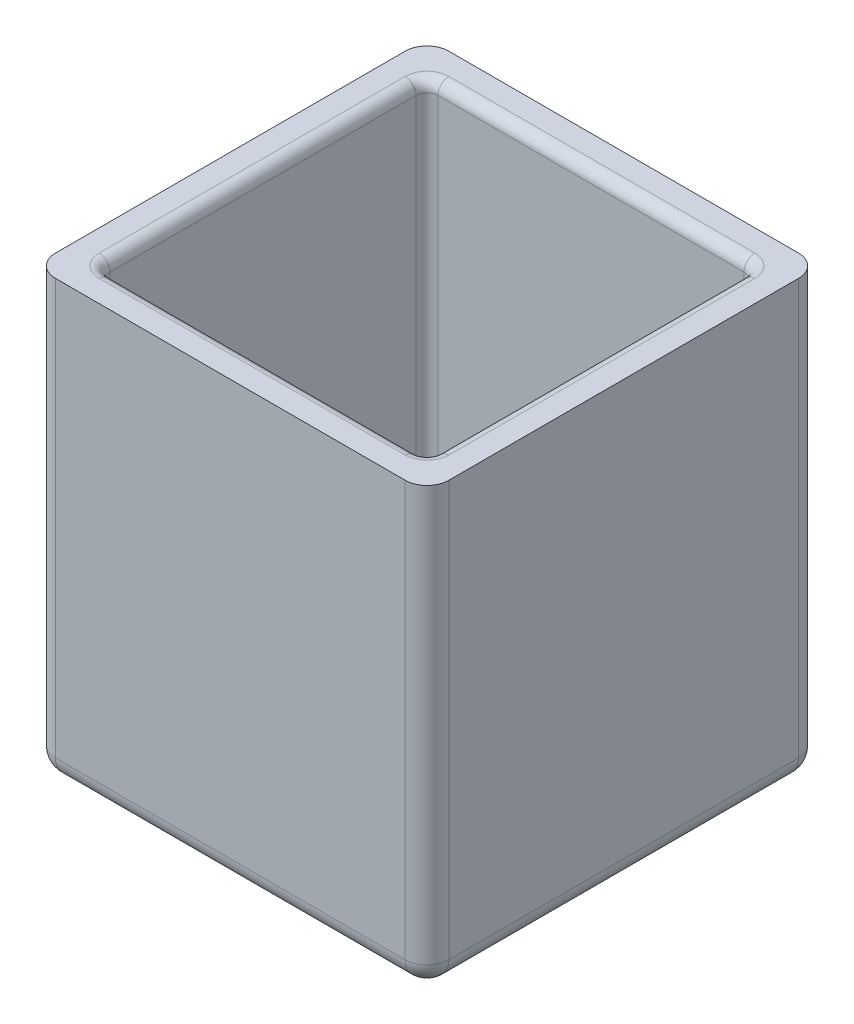
ISO-10303-21;
HEADER;
FILE_DESCRIPTION(('STEP AP214'),'2;1');
FILE_NAME('part.step','',(''),(''),'','','');
FILE_SCHEMA(('AUTOMOTIVE_DESIGN { 1 0 10303 214 1 1 1 1 }'));
ENDSEC;
DATA;
#1=APPLICATION_CONTEXT('core data for automotive mechanical design processes');
#2=APPLICATION_PROTOCOL_DEFINITION('international standard','automotive_design',2000,#1);
#3=PRODUCT_CONTEXT('',#1,'mechanical');
#4=PRODUCT('Part','Part','',(#3));
#5=PRODUCT_RELATED_PRODUCT_CATEGORY('part','',(#4));
#6=PRODUCT_DEFINITION_FORMATION('','',#4);
#7=PRODUCT_DEFINITION_CONTEXT('part definition',#1,'design');
#8=PRODUCT_DEFINITION('design','',#6,#7);
#9=PRODUCT_DEFINITION_SHAPE('','',#8);
#10=(LENGTH_UNIT() NAMED_UNIT(*) SI_UNIT(.MILLI.,.METRE.));
#11=(NAMED_UNIT(*) PLANE_ANGLE_UNIT() SI_UNIT($,.RADIAN.));
#12=(NAMED_UNIT(*) SI_UNIT($,.STERADIAN.) SOLID_ANGLE_UNIT());
#13=UNCERTAINTY_MEASURE_WITH_UNIT(LENGTH_MEASURE(1.E-05),#10,'distance_accuracy_value','');
#14=(GEOMETRIC_REPRESENTATION_CONTEXT(3) GLOBAL_UNCERTAINTY_ASSIGNED_CONTEXT((#13)) GLOBAL_UNIT_ASSIGNED_CONTEXT((#10,
#11,#12)) REPRESENTATION_CONTEXT('',''));
#15=CARTESIAN_POINT('',(0.,0.,0.));
#16=DIRECTION('',(0.,0.,1.));
#17=DIRECTION('',(1.,0.,0.));
#18=AXIS2_PLACEMENT_3D('',#15,#16,#17);
#19=CARTESIAN_POINT('',(0.,40.,0.));
#20=DIRECTION('',(0.,-1.,0.));
#21=DIRECTION('',(0.,0.,-1.));
#22=AXIS2_PLACEMENT_3D('',#19,#20,#21);
#23=PLANE('',#22);
#24=DIRECTION('',(-1.,0.,0.));
#25=VECTOR('',#24,1.);
#26=CARTESIAN_POINT('',(0.,40.,-36.));
#27=LINE('',#26,#25);
#28=CARTESIAN_POINT('',(34.,40.,-36.));
#29=VERTEX_POINT('',#28);
#30=CARTESIAN_POINT('',(2.,40.,-36.));
#31=VERTEX_POINT('',#30);
#32=EDGE_CURVE('E206',#29,#31,#27,.T.);
#33=ORIENTED_EDGE('',*,*,#32,.T.);
#34=CARTESIAN_POINT('',(2.,40.,-34.));
#35=DIRECTION('',(0.,-1.,0.));
#36=DIRECTION('',(0.,0.,-1.));
#37=AXIS2_PLACEMENT_3D('',#34,#35,#36);
#38=CIRCLE('',#37,2.);
#39=CARTESIAN_POINT('',(0.,40.,-34.));
#40=VERTEX_POINT('',#39);
#41=EDGE_CURVE('E200',#31,#40,#38,.F.);
#42=ORIENTED_EDGE('',*,*,#41,.T.);
#43=DIRECTION('',(0.,0.,1.));
#44=VECTOR('',#43,1.);
#45=CARTESIAN_POINT('',(0.,40.,0.));
#46=LINE('',#45,#44);
#47=CARTESIAN_POINT('',(0.,40.,-2.));
#48=VERTEX_POINT('',#47);
#49=EDGE_CURVE('E203',#40,#48,#46,.T.);
#50=ORIENTED_EDGE('',*,*,#49,.T.);
#51=CARTESIAN_POINT('',(2.,40.,-2.));
#52=DIRECTION('',(0.,-1.,0.));
#53=DIRECTION('',(0.,0.,-1.));
#54=AXIS2_PLACEMENT_3D('',#51,#52,#53);
#55=CIRCLE('',#54,2.);
#56=CARTESIAN_POINT('',(2.,40.,0.));
#57=VERTEX_POINT('',#56);
#58=EDGE_CURVE('E211',#48,#57,#55,.F.);
#59=ORIENTED_EDGE('',*,*,#58,.T.);
#60=DIRECTION('',(1.,0.,0.));
#61=VECTOR('',#60,1.);
#62=CARTESIAN_POINT('',(0.,40.,0.));
#63=LINE('',#62,#61);
#64=CARTESIAN_POINT('',(34.,40.,0.));
#65=VERTEX_POINT('',#64);
#66=EDGE_CURVE('E220',#57,#65,#63,.T.);
#67=ORIENTED_EDGE('',*,*,#66,.T.);
#68=CARTESIAN_POINT('',(34.,40.,-2.));
#69=DIRECTION('',(0.,-1.,0.));
#70=DIRECTION('',(0.,0.,-1.));
#71=AXIS2_PLACEMENT_3D('',#68,#69,#70);
#72=CIRCLE('',#71,2.);
#73=CARTESIAN_POINT('',(36.,40.,-2.));
#74=VERTEX_POINT('',#73);
#75=EDGE_CURVE('E235',#65,#74,#72,.F.);
#76=ORIENTED_EDGE('',*,*,#75,.T.);
#77=DIRECTION('',(0.,0.,-1.));
#78=VECTOR('',#77,1.);
#79=CARTESIAN_POINT('',(36.,40.,0.));
#80=LINE('',#79,#78);
#81=CARTESIAN_POINT('',(36.,40.,-34.));
#82=VERTEX_POINT('',#81);
#83=EDGE_CURVE('E911',#74,#82,#80,.T.);
#84=ORIENTED_EDGE('',*,*,#83,.T.);
#85=CARTESIAN_POINT('',(34.,40.,-34.));
#86=DIRECTION('',(0.,-1.,0.));
#87=DIRECTION('',(0.,0.,-1.));
#88=AXIS2_PLACEMENT_3D('',#85,#86,#87);
#89=CIRCLE('',#88,2.);
#90=EDGE_CURVE('E237',#82,#29,#89,.F.);
#91=ORIENTED_EDGE('',*,*,#90,.T.);
#92=EDGE_LOOP('',(#33,#42,#50,#59,#67,#76,#84,#91));
#93=FACE_BOUND('',#92,.T.);
#94=CARTESIAN_POINT('',(32.,40.,-4.));
#95=DIRECTION('',(0.,-1.,0.));
#96=DIRECTION('',(0.,0.,-1.));
#97=AXIS2_PLACEMENT_3D('',#94,#95,#96);
#98=CIRCLE('',#97,2.);
#99=CARTESIAN_POINT('',(32.,40.,-2.));
#100=VERTEX_POINT('',#99);
#101=CARTESIAN_POINT('',(34.,40.,-4.));
#102=VERTEX_POINT('',#101);
#103=EDGE_CURVE('E322',#100,#102,#98,.F.);
#104=ORIENTED_EDGE('',*,*,#103,.F.);
#105=DIRECTION('',(1.,0.,0.));
#106=VECTOR('',#105,1.);
#107=CARTESIAN_POINT('',(3.,40.,-2.));
#108=LINE('',#107,#106);
#109=CARTESIAN_POINT('',(4.,40.,-2.));
#110=VERTEX_POINT('',#109);
#111=EDGE_CURVE('E319',#100,#110,#108,.F.);
#112=ORIENTED_EDGE('',*,*,#111,.T.);
#113=CARTESIAN_POINT('',(4.,40.,-4.));
#114=DIRECTION('',(0.,-1.,0.));
#115=DIRECTION('',(0.,0.,-1.));
#116=AXIS2_PLACEMENT_3D('',#113,#114,#115);
#117=CIRCLE('',#116,2.);
#118=CARTESIAN_POINT('',(2.,40.,-4.));
#119=VERTEX_POINT('',#118);
#120=EDGE_CURVE('E316',#119,#110,#117,.F.);
#121=ORIENTED_EDGE('',*,*,#120,.F.);
#122=DIRECTION('',(0.,0.,1.));
#123=VECTOR('',#122,1.);
#124=CARTESIAN_POINT('',(2.,40.,-33.));
#125=LINE('',#124,#123);
#126=CARTESIAN_POINT('',(2.,40.,-32.));
#127=VERTEX_POINT('',#126);
#128=EDGE_CURVE('E312',#119,#127,#125,.F.);
#129=ORIENTED_EDGE('',*,*,#128,.T.);
#130=CARTESIAN_POINT('',(4.,40.,-32.));
#131=DIRECTION('',(0.,-1.,0.));
#132=DIRECTION('',(0.,0.,-1.));
#133=AXIS2_PLACEMENT_3D('',#130,#131,#132);
#134=CIRCLE('',#133,2.);
#135=CARTESIAN_POINT('',(4.,40.,-34.));
#136=VERTEX_POINT('',#135);
#137=EDGE_CURVE('E309',#136,#127,#134,.F.);
#138=ORIENTED_EDGE('',*,*,#137,.F.);
#139=DIRECTION('',(-1.,0.,0.));
#140=VECTOR('',#139,1.);
#141=CARTESIAN_POINT('',(33.,40.,-34.));
#142=LINE('',#141,#140);
#143=CARTESIAN_POINT('',(32.,40.,-34.));
#144=VERTEX_POINT('',#143);
#145=EDGE_CURVE('E307',#136,#144,#142,.F.);
#146=ORIENTED_EDGE('',*,*,#145,.T.);
#147=CARTESIAN_POINT('',(32.,40.,-32.));
#148=DIRECTION('',(0.,-1.,0.));
#149=DIRECTION('',(0.,0.,-1.));
#150=AXIS2_PLACEMENT_3D('',#147,#148,#149);
#151=CIRCLE('',#150,2.);
#152=CARTESIAN_POINT('',(34.,40.,-32.));
#153=VERTEX_POINT('',#152);
#154=EDGE_CURVE('E304',#153,#144,#151,.F.);
#155=ORIENTED_EDGE('',*,*,#154,.F.);
#156=DIRECTION('',(0.,0.,-1.));
#157=VECTOR('',#156,1.);
#158=CARTESIAN_POINT('',(34.,40.,-3.));
#159=LINE('',#158,#157);
#160=EDGE_CURVE('E314',#153,#102,#159,.F.);
#161=ORIENTED_EDGE('',*,*,#160,.T.);
#162=EDGE_LOOP('',(#104,#112,#121,#129,#138,#146,#155,#161));
#163=FACE_BOUND('',#162,.T.);
#164=ADVANCED_FACE('F38',(#93,#163),#23,.F.);
#165=CARTESIAN_POINT('',(3.,40.,-33.));
#166=DIRECTION('',(1.,0.,0.));
#167=DIRECTION('',(0.,0.,-1.));
#168=AXIS2_PLACEMENT_3D('',#165,#166,#167);
#169=PLANE('',#168);
#170=DIRECTION('',(0.,0.,-1.));
#171=VECTOR('',#170,1.);
#172=CARTESIAN_POINT('',(3.,4.,-33.));
#173=LINE('',#172,#171);
#174=CARTESIAN_POINT('',(3.,4.,-4.));
#175=VERTEX_POINT('',#174);
#176=CARTESIAN_POINT('',(3.,4.,-32.));
#177=VERTEX_POINT('',#176);
#178=EDGE_CURVE('E336',#175,#177,#173,.T.);
#179=ORIENTED_EDGE('',*,*,#178,.T.);
#180=DIRECTION('',(0.,-1.,0.));
#181=VECTOR('',#180,1.);
#182=CARTESIAN_POINT('',(3.,40.,-32.));
#183=LINE('',#182,#181);
#184=CARTESIAN_POINT('',(3.,39.,-32.));
#185=VERTEX_POINT('',#184);
#186=EDGE_CURVE('E341',#177,#185,#183,.F.);
#187=ORIENTED_EDGE('',*,*,#186,.T.);
#188=DIRECTION('',(0.,0.,1.));
#189=VECTOR('',#188,1.);
#190=CARTESIAN_POINT('',(3.,39.,-3.));
#191=LINE('',#190,#189);
#192=CARTESIAN_POINT('',(3.,39.,-4.));
#193=VERTEX_POINT('',#192);
#194=EDGE_CURVE('E338',#185,#193,#191,.T.);
#195=ORIENTED_EDGE('',*,*,#194,.T.);
#196=DIRECTION('',(0.,-1.,0.));
#197=VECTOR('',#196,1.);
#198=CARTESIAN_POINT('',(3.,3.,-4.));
#199=LINE('',#198,#197);
#200=EDGE_CURVE('E334',#193,#175,#199,.T.);
#201=ORIENTED_EDGE('',*,*,#200,.T.);
#202=EDGE_LOOP('',(#179,#187,#195,#201));
#203=FACE_BOUND('',#202,.T.);
#204=ADVANCED_FACE('F436',(#203),#169,.T.);
#205=CARTESIAN_POINT('',(3.,40.,-3.));
#206=DIRECTION('',(0.,0.,-1.));
#207=DIRECTION('',(-1.,0.,0.));
#208=AXIS2_PLACEMENT_3D('',#205,#206,#207);
#209=PLANE('',#208);
#210=DIRECTION('',(1.,0.,0.));
#211=VECTOR('',#210,1.);
#212=CARTESIAN_POINT('',(33.,39.,-3.));
#213=LINE('',#212,#211);
#214=CARTESIAN_POINT('',(4.,39.,-3.));
#215=VERTEX_POINT('',#214);
#216=CARTESIAN_POINT('',(32.,39.,-3.));
#217=VERTEX_POINT('',#216);
#218=EDGE_CURVE('E299',#215,#217,#213,.T.);
#219=ORIENTED_EDGE('',*,*,#218,.T.);
#220=DIRECTION('',(0.,-1.,0.));
#221=VECTOR('',#220,1.);
#222=CARTESIAN_POINT('',(32.,3.,-3.));
#223=LINE('',#222,#221);
#224=CARTESIAN_POINT('',(32.,4.,-3.));
#225=VERTEX_POINT('',#224);
#226=EDGE_CURVE('E302',#217,#225,#223,.T.);
#227=ORIENTED_EDGE('',*,*,#226,.T.);
#228=DIRECTION('',(-1.,0.,0.));
#229=VECTOR('',#228,1.);
#230=CARTESIAN_POINT('',(3.,4.,-3.));
#231=LINE('',#230,#229);
#232=CARTESIAN_POINT('',(4.,4.,-3.));
#233=VERTEX_POINT('',#232);
#234=EDGE_CURVE('E297',#225,#233,#231,.T.);
#235=ORIENTED_EDGE('',*,*,#234,.T.);
#236=DIRECTION('',(0.,-1.,0.));
#237=VECTOR('',#236,1.);
#238=CARTESIAN_POINT('',(4.,40.,-3.));
#239=LINE('',#238,#237);
#240=EDGE_CURVE('E274',#233,#215,#239,.F.);
#241=ORIENTED_EDGE('',*,*,#240,.T.);
#242=EDGE_LOOP('',(#219,#227,#235,#241));
#243=FACE_BOUND('',#242,.T.);
#244=ADVANCED_FACE('F491',(#243),#209,.T.);
#245=CARTESIAN_POINT('',(33.,40.,-33.));
#246=DIRECTION('',(-1.,0.,0.));
#247=DIRECTION('',(0.,0.,1.));
#248=AXIS2_PLACEMENT_3D('',#245,#246,#247);
#249=PLANE('',#248);
#250=DIRECTION('',(0.,0.,-1.));
#251=VECTOR('',#250,1.);
#252=CARTESIAN_POINT('',(33.,39.,-33.));
#253=LINE('',#252,#251);
#254=CARTESIAN_POINT('',(33.,39.,-4.));
#255=VERTEX_POINT('',#254);
#256=CARTESIAN_POINT('',(33.,39.,-32.));
#257=VERTEX_POINT('',#256);
#258=EDGE_CURVE('E329',#255,#257,#253,.T.);
#259=ORIENTED_EDGE('',*,*,#258,.T.);
#260=DIRECTION('',(0.,-1.,0.));
#261=VECTOR('',#260,1.);
#262=CARTESIAN_POINT('',(33.,3.,-32.));
#263=LINE('',#262,#261);
#264=CARTESIAN_POINT('',(33.,4.,-32.));
#265=VERTEX_POINT('',#264);
#266=EDGE_CURVE('E332',#257,#265,#263,.T.);
#267=ORIENTED_EDGE('',*,*,#266,.T.);
#268=DIRECTION('',(0.,0.,1.));
#269=VECTOR('',#268,1.);
#270=CARTESIAN_POINT('',(33.,4.,-33.));
#271=LINE('',#270,#269);
#272=CARTESIAN_POINT('',(33.,4.,-4.));
#273=VERTEX_POINT('',#272);
#274=EDGE_CURVE('E327',#265,#273,#271,.T.);
#275=ORIENTED_EDGE('',*,*,#274,.T.);
#276=DIRECTION('',(0.,-1.,0.));
#277=VECTOR('',#276,1.);
#278=CARTESIAN_POINT('',(33.,40.,-4.));
#279=LINE('',#278,#277);
#280=EDGE_CURVE('E325',#273,#255,#279,.F.);
#281=ORIENTED_EDGE('',*,*,#280,.T.);
#282=EDGE_LOOP('',(#259,#267,#275,#281));
#283=FACE_BOUND('',#282,.T.);
#284=ADVANCED_FACE('F831',(#283),#249,.T.);
#285=CARTESIAN_POINT('',(3.,40.,-33.));
#286=DIRECTION('',(0.,0.,1.));
#287=DIRECTION('',(1.,0.,0.));
#288=AXIS2_PLACEMENT_3D('',#285,#286,#287);
#289=PLANE('',#288);
#290=DIRECTION('',(0.,-1.,0.));
#291=VECTOR('',#290,1.);
#292=CARTESIAN_POINT('',(32.,40.,-33.));
#293=LINE('',#292,#291);
#294=CARTESIAN_POINT('',(32.,4.,-33.));
#295=VERTEX_POINT('',#294);
#296=CARTESIAN_POINT('',(32.,39.,-33.));
#297=VERTEX_POINT('',#296);
#298=EDGE_CURVE('E47',#295,#297,#293,.F.);
#299=ORIENTED_EDGE('',*,*,#298,.T.);
#300=DIRECTION('',(-1.,0.,0.));
#301=VECTOR('',#300,1.);
#302=CARTESIAN_POINT('',(3.,39.,-33.));
#303=LINE('',#302,#301);
#304=CARTESIAN_POINT('',(4.,39.,-33.));
#305=VERTEX_POINT('',#304);
#306=EDGE_CURVE('E11',#297,#305,#303,.T.);
#307=ORIENTED_EDGE('',*,*,#306,.T.);
#308=DIRECTION('',(0.,-1.,0.));
#309=VECTOR('',#308,1.);
#310=CARTESIAN_POINT('',(4.,3.,-33.));
#311=LINE('',#310,#309);
#312=CARTESIAN_POINT('',(4.,4.,-33.));
#313=VERTEX_POINT('',#312);
#314=EDGE_CURVE('E352',#305,#313,#311,.T.);
#315=ORIENTED_EDGE('',*,*,#314,.T.);
#316=DIRECTION('',(1.,0.,0.));
#317=VECTOR('',#316,1.);
#318=CARTESIAN_POINT('',(3.,4.,-33.));
#319=LINE('',#318,#317);
#320=EDGE_CURVE('E58',#313,#295,#319,.T.);
#321=ORIENTED_EDGE('',*,*,#320,.T.);
#322=EDGE_LOOP('',(#299,#307,#315,#321));
#323=FACE_BOUND('',#322,.T.);
#324=ADVANCED_FACE('F474',(#323),#289,.T.);
#325=CARTESIAN_POINT('',(0.,0.,0.));
#326=DIRECTION('',(0.,-1.,0.));
#327=DIRECTION('',(0.,0.,-1.));
#328=AXIS2_PLACEMENT_3D('',#325,#326,#327);
#329=PLANE('',#328);
#330=DIRECTION('',(0.,0.,-1.));
#331=VECTOR('',#330,1.);
#332=CARTESIAN_POINT('',(34.,0.,-2.));
#333=LINE('',#332,#331);
#334=CARTESIAN_POINT('',(34.,0.,-34.));
#335=VERTEX_POINT('',#334);
#336=CARTESIAN_POINT('',(34.,0.,-2.));
#337=VERTEX_POINT('',#336);
#338=EDGE_CURVE('E254',#335,#337,#333,.F.);
#339=ORIENTED_EDGE('',*,*,#338,.T.);
#340=DIRECTION('',(1.,0.,0.));
#341=VECTOR('',#340,1.);
#342=CARTESIAN_POINT('',(2.,0.,-2.));
#343=LINE('',#342,#341);
#344=CARTESIAN_POINT('',(2.,0.,-2.));
#345=VERTEX_POINT('',#344);
#346=EDGE_CURVE('E260',#337,#345,#343,.F.);
#347=ORIENTED_EDGE('',*,*,#346,.T.);
#348=DIRECTION('',(0.,0.,1.));
#349=VECTOR('',#348,1.);
#350=CARTESIAN_POINT('',(2.,0.,-34.));
#351=LINE('',#350,#349);
#352=CARTESIAN_POINT('',(2.,0.,-34.));
#353=VERTEX_POINT('',#352);
#354=EDGE_CURVE('E258',#345,#353,#351,.F.);
#355=ORIENTED_EDGE('',*,*,#354,.T.);
#356=DIRECTION('',(-1.,0.,0.));
#357=VECTOR('',#356,1.);
#358=CARTESIAN_POINT('',(34.,0.,-34.));
#359=LINE('',#358,#357);
#360=EDGE_CURVE('E256',#353,#335,#359,.F.);
#361=ORIENTED_EDGE('',*,*,#360,.T.);
#362=EDGE_LOOP('',(#339,#347,#355,#361));
#363=FACE_BOUND('',#362,.T.);
#364=ADVANCED_FACE('F495',(#363),#329,.T.);
#365=CARTESIAN_POINT('',(0.,40.,0.));
#366=DIRECTION('',(1.,0.,0.));
#367=DIRECTION('',(0.,0.,-1.));
#368=AXIS2_PLACEMENT_3D('',#365,#366,#367);
#369=PLANE('',#368);
#370=DIRECTION('',(0.,-1.,0.));
#371=VECTOR('',#370,1.);
#372=CARTESIAN_POINT('',(0.,40.,-34.));
#373=LINE('',#372,#371);
#374=CARTESIAN_POINT('',(0.,2.,-34.));
#375=VERTEX_POINT('',#374);
#376=EDGE_CURVE('E216',#40,#375,#373,.T.);
#377=ORIENTED_EDGE('',*,*,#376,.T.);
#378=DIRECTION('',(0.,0.,1.));
#379=VECTOR('',#378,1.);
#380=CARTESIAN_POINT('',(0.,2.,-2.));
#381=LINE('',#380,#379);
#382=CARTESIAN_POINT('',(0.,2.,-2.));
#383=VERTEX_POINT('',#382);
#384=EDGE_CURVE('E265',#375,#383,#381,.T.);
#385=ORIENTED_EDGE('',*,*,#384,.T.);
#386=DIRECTION('',(0.,-1.,0.));
#387=VECTOR('',#386,1.);
#388=CARTESIAN_POINT('',(0.,40.,-2.));
#389=LINE('',#388,#387);
#390=EDGE_CURVE('E219',#383,#48,#389,.F.);
#391=ORIENTED_EDGE('',*,*,#390,.T.);
#392=ORIENTED_EDGE('',*,*,#49,.F.);
#393=EDGE_LOOP('',(#377,#385,#391,#392));
#394=FACE_BOUND('',#393,.T.);
#395=ADVANCED_FACE('F215',(#394),#369,.F.);
#396=CARTESIAN_POINT('',(0.,40.,0.));
#397=DIRECTION('',(0.,0.,-1.));
#398=DIRECTION('',(-1.,0.,0.));
#399=AXIS2_PLACEMENT_3D('',#396,#397,#398);
#400=PLANE('',#399);
#401=DIRECTION('',(0.,-1.,0.));
#402=VECTOR('',#401,1.);
#403=CARTESIAN_POINT('',(2.,40.,0.));
#404=LINE('',#403,#402);
#405=CARTESIAN_POINT('',(2.,2.,0.));
#406=VERTEX_POINT('',#405);
#407=EDGE_CURVE('E241',#57,#406,#404,.T.);
#408=ORIENTED_EDGE('',*,*,#407,.T.);
#409=DIRECTION('',(1.,0.,0.));
#410=VECTOR('',#409,1.);
#411=CARTESIAN_POINT('',(34.,2.,0.));
#412=LINE('',#411,#410);
#413=CARTESIAN_POINT('',(34.,2.,0.));
#414=VERTEX_POINT('',#413);
#415=EDGE_CURVE('E252',#406,#414,#412,.T.);
#416=ORIENTED_EDGE('',*,*,#415,.T.);
#417=DIRECTION('',(0.,-1.,0.));
#418=VECTOR('',#417,1.);
#419=CARTESIAN_POINT('',(34.,40.,0.));
#420=LINE('',#419,#418);
#421=EDGE_CURVE('E210',#414,#65,#420,.F.);
#422=ORIENTED_EDGE('',*,*,#421,.T.);
#423=ORIENTED_EDGE('',*,*,#66,.F.);
#424=EDGE_LOOP('',(#408,#416,#422,#423));
#425=FACE_BOUND('',#424,.T.);
#426=ADVANCED_FACE('F506',(#425),#400,.F.);
#427=CARTESIAN_POINT('',(36.,40.,0.));
#428=DIRECTION('',(-1.,0.,0.));
#429=DIRECTION('',(0.,0.,1.));
#430=AXIS2_PLACEMENT_3D('',#427,#428,#429);
#431=PLANE('',#430);
#432=DIRECTION('',(0.,-1.,0.));
#433=VECTOR('',#432,1.);
#434=CARTESIAN_POINT('',(36.,40.,-2.));
#435=LINE('',#434,#433);
#436=CARTESIAN_POINT('',(36.,2.,-2.));
#437=VERTEX_POINT('',#436);
#438=EDGE_CURVE('E244',#74,#437,#435,.T.);
#439=ORIENTED_EDGE('',*,*,#438,.T.);
#440=DIRECTION('',(0.,0.,-1.));
#441=VECTOR('',#440,1.);
#442=CARTESIAN_POINT('',(36.,2.,-34.));
#443=LINE('',#442,#441);
#444=CARTESIAN_POINT('',(36.,2.,-34.));
#445=VERTEX_POINT('',#444);
#446=EDGE_CURVE('E272',#437,#445,#443,.T.);
#447=ORIENTED_EDGE('',*,*,#446,.T.);
#448=DIRECTION('',(0.,-1.,0.));
#449=VECTOR('',#448,1.);
#450=CARTESIAN_POINT('',(36.,40.,-34.));
#451=LINE('',#450,#449);
#452=EDGE_CURVE('E247',#445,#82,#451,.F.);
#453=ORIENTED_EDGE('',*,*,#452,.T.);
#454=ORIENTED_EDGE('',*,*,#83,.F.);
#455=EDGE_LOOP('',(#439,#447,#453,#454));
#456=FACE_BOUND('',#455,.T.);
#457=ADVANCED_FACE('F502',(#456),#431,.F.);
#458=CARTESIAN_POINT('',(0.,40.,-36.));
#459=DIRECTION('',(0.,0.,1.));
#460=DIRECTION('',(1.,0.,0.));
#461=AXIS2_PLACEMENT_3D('',#458,#459,#460);
#462=PLANE('',#461);
#463=DIRECTION('',(0.,-1.,0.));
#464=VECTOR('',#463,1.);
#465=CARTESIAN_POINT('',(34.,40.,-36.));
#466=LINE('',#465,#464);
#467=CARTESIAN_POINT('',(34.,2.,-36.));
#468=VERTEX_POINT('',#467);
#469=EDGE_CURVE('E226',#29,#468,#466,.T.);
#470=ORIENTED_EDGE('',*,*,#469,.T.);
#471=DIRECTION('',(-1.,0.,0.));
#472=VECTOR('',#471,1.);
#473=CARTESIAN_POINT('',(2.,2.,-36.));
#474=LINE('',#473,#472);
#475=CARTESIAN_POINT('',(2.,2.,-36.));
#476=VERTEX_POINT('',#475);
#477=EDGE_CURVE('E268',#468,#476,#474,.T.);
#478=ORIENTED_EDGE('',*,*,#477,.T.);
#479=DIRECTION('',(0.,-1.,0.));
#480=VECTOR('',#479,1.);
#481=CARTESIAN_POINT('',(2.,40.,-36.));
#482=LINE('',#481,#480);
#483=EDGE_CURVE('E229',#476,#31,#482,.F.);
#484=ORIENTED_EDGE('',*,*,#483,.T.);
#485=ORIENTED_EDGE('',*,*,#32,.F.);
#486=EDGE_LOOP('',(#470,#478,#484,#485));
#487=FACE_BOUND('',#486,.T.);
#488=ADVANCED_FACE('F499',(#487),#462,.F.);
#489=CARTESIAN_POINT('',(0.,3.,0.));
#490=DIRECTION('',(0.,-1.,0.));
#491=DIRECTION('',(0.,0.,-1.));
#492=AXIS2_PLACEMENT_3D('',#489,#490,#491);
#493=PLANE('',#492);
#494=DIRECTION('',(-1.,0.,0.));
#495=VECTOR('',#494,1.);
#496=CARTESIAN_POINT('',(0.,3.,-4.));
#497=LINE('',#496,#495);
#498=CARTESIAN_POINT('',(4.,3.,-4.));
#499=VERTEX_POINT('',#498);
#500=CARTESIAN_POINT('',(32.,3.,-4.));
#501=VERTEX_POINT('',#500);
#502=EDGE_CURVE('E347',#499,#501,#497,.F.);
#503=ORIENTED_EDGE('',*,*,#502,.T.);
#504=DIRECTION('',(0.,0.,1.));
#505=VECTOR('',#504,1.);
#506=CARTESIAN_POINT('',(32.,3.,0.));
#507=LINE('',#506,#505);
#508=CARTESIAN_POINT('',(32.,3.,-32.));
#509=VERTEX_POINT('',#508);
#510=EDGE_CURVE('E349',#501,#509,#507,.F.);
#511=ORIENTED_EDGE('',*,*,#510,.T.);
#512=DIRECTION('',(1.,0.,0.));
#513=VECTOR('',#512,1.);
#514=CARTESIAN_POINT('',(0.,3.,-32.));
#515=LINE('',#514,#513);
#516=CARTESIAN_POINT('',(4.,3.,-32.));
#517=VERTEX_POINT('',#516);
#518=EDGE_CURVE('E343',#509,#517,#515,.F.);
#519=ORIENTED_EDGE('',*,*,#518,.T.);
#520=DIRECTION('',(0.,0.,-1.));
#521=VECTOR('',#520,1.);
#522=CARTESIAN_POINT('',(4.,3.,0.));
#523=LINE('',#522,#521);
#524=EDGE_CURVE('E345',#517,#499,#523,.F.);
#525=ORIENTED_EDGE('',*,*,#524,.T.);
#526=EDGE_LOOP('',(#503,#511,#519,#525));
#527=FACE_BOUND('',#526,.T.);
#528=ADVANCED_FACE('F445',(#527),#493,.F.);
#529=CARTESIAN_POINT('',(2.,40.,-34.));
#530=DIRECTION('',(0.,-1.,0.));
#531=DIRECTION('',(0.,0.,-1.));
#532=AXIS2_PLACEMENT_3D('',#529,#530,#531);
#533=CYLINDRICAL_SURFACE('',#532,2.);
#534=ORIENTED_EDGE('',*,*,#483,.F.);
#535=CARTESIAN_POINT('',(2.,2.,-34.));
#536=DIRECTION('',(0.,-1.,0.));
#537=DIRECTION('',(0.,0.,-1.));
#538=AXIS2_PLACEMENT_3D('',#535,#536,#537);
#539=CIRCLE('',#538,2.);
#540=EDGE_CURVE('E225',#476,#375,#539,.F.);
#541=ORIENTED_EDGE('',*,*,#540,.T.);
#542=ORIENTED_EDGE('',*,*,#376,.F.);
#543=ORIENTED_EDGE('',*,*,#41,.F.);
#544=EDGE_LOOP('',(#534,#541,#542,#543));
#545=FACE_BOUND('',#544,.T.);
#546=ADVANCED_FACE('F223',(#545),#533,.T.);
#547=CARTESIAN_POINT('',(2.,40.,-2.));
#548=DIRECTION('',(0.,-1.,0.));
#549=DIRECTION('',(0.,0.,-1.));
#550=AXIS2_PLACEMENT_3D('',#547,#548,#549);
#551=CYLINDRICAL_SURFACE('',#550,2.);
#552=ORIENTED_EDGE('',*,*,#390,.F.);
#553=CARTESIAN_POINT('',(2.,2.,-2.));
#554=DIRECTION('',(0.,-1.,0.));
#555=DIRECTION('',(0.,0.,-1.));
#556=AXIS2_PLACEMENT_3D('',#553,#554,#555);
#557=CIRCLE('',#556,2.);
#558=EDGE_CURVE('E263',#383,#406,#557,.F.);
#559=ORIENTED_EDGE('',*,*,#558,.T.);
#560=ORIENTED_EDGE('',*,*,#407,.F.);
#561=ORIENTED_EDGE('',*,*,#58,.F.);
#562=EDGE_LOOP('',(#552,#559,#560,#561));
#563=FACE_BOUND('',#562,.T.);
#564=ADVANCED_FACE('F515',(#563),#551,.T.);
#565=CARTESIAN_POINT('',(34.,40.,-34.));
#566=DIRECTION('',(0.,-1.,0.));
#567=DIRECTION('',(0.,0.,-1.));
#568=AXIS2_PLACEMENT_3D('',#565,#566,#567);
#569=CYLINDRICAL_SURFACE('',#568,2.);
#570=ORIENTED_EDGE('',*,*,#452,.F.);
#571=CARTESIAN_POINT('',(34.,2.,-34.));
#572=DIRECTION('',(0.,-1.,0.));
#573=DIRECTION('',(0.,0.,-1.));
#574=AXIS2_PLACEMENT_3D('',#571,#572,#573);
#575=CIRCLE('',#574,2.);
#576=EDGE_CURVE('E270',#445,#468,#575,.F.);
#577=ORIENTED_EDGE('',*,*,#576,.T.);
#578=ORIENTED_EDGE('',*,*,#469,.F.);
#579=ORIENTED_EDGE('',*,*,#90,.F.);
#580=EDGE_LOOP('',(#570,#577,#578,#579));
#581=FACE_BOUND('',#580,.T.);
#582=ADVANCED_FACE('F518',(#581),#569,.T.);
#583=CARTESIAN_POINT('',(34.,40.,-2.));
#584=DIRECTION('',(0.,-1.,0.));
#585=DIRECTION('',(0.,0.,-1.));
#586=AXIS2_PLACEMENT_3D('',#583,#584,#585);
#587=CYLINDRICAL_SURFACE('',#586,2.);
#588=ORIENTED_EDGE('',*,*,#421,.F.);
#589=CARTESIAN_POINT('',(34.,2.,-2.));
#590=DIRECTION('',(0.,-1.,0.));
#591=DIRECTION('',(0.,0.,-1.));
#592=AXIS2_PLACEMENT_3D('',#589,#590,#591);
#593=CIRCLE('',#592,2.);
#594=EDGE_CURVE('E249',#414,#437,#593,.F.);
#595=ORIENTED_EDGE('',*,*,#594,.T.);
#596=ORIENTED_EDGE('',*,*,#438,.F.);
#597=ORIENTED_EDGE('',*,*,#75,.F.);
#598=EDGE_LOOP('',(#588,#595,#596,#597));
#599=FACE_BOUND('',#598,.T.);
#600=ADVANCED_FACE('F522',(#599),#587,.T.);
#601=CARTESIAN_POINT('',(2.,2.,-34.));
#602=DIRECTION('',(0.,-1.,0.));
#603=DIRECTION('',(0.,0.,-1.));
#604=AXIS2_PLACEMENT_3D('',#601,#602,#603);
#605=SPHERICAL_SURFACE('',#604,2.);
#606=CARTESIAN_POINT('',(2.,2.,-34.));
#607=DIRECTION('',(0.,0.,1.));
#608=DIRECTION('',(1.,0.,0.));
#609=AXIS2_PLACEMENT_3D('',#606,#607,#608);
#610=CIRCLE('',#609,2.);
#611=EDGE_CURVE('E291',#375,#353,#610,.T.);
#612=ORIENTED_EDGE('',*,*,#611,.F.);
#613=ORIENTED_EDGE('',*,*,#540,.F.);
#614=CARTESIAN_POINT('',(2.,2.,-34.));
#615=DIRECTION('',(1.,0.,0.));
#616=DIRECTION('',(0.,0.,-1.));
#617=AXIS2_PLACEMENT_3D('',#614,#615,#616);
#618=CIRCLE('',#617,2.);
#619=EDGE_CURVE('E221',#353,#476,#618,.T.);
#620=ORIENTED_EDGE('',*,*,#619,.F.);
#621=EDGE_LOOP('',(#612,#613,#620));
#622=FACE_BOUND('',#621,.T.);
#623=ADVANCED_FACE('F525',(#622),#605,.T.);
#624=CARTESIAN_POINT('',(0.,2.,-34.));
#625=DIRECTION('',(1.,0.,0.));
#626=DIRECTION('',(0.,0.,-1.));
#627=AXIS2_PLACEMENT_3D('',#624,#625,#626);
#628=CYLINDRICAL_SURFACE('',#627,2.);
#629=ORIENTED_EDGE('',*,*,#619,.T.);
#630=ORIENTED_EDGE('',*,*,#477,.F.);
#631=CARTESIAN_POINT('',(34.,2.,-34.));
#632=DIRECTION('',(1.,0.,0.));
#633=DIRECTION('',(0.,0.,-1.));
#634=AXIS2_PLACEMENT_3D('',#631,#632,#633);
#635=CIRCLE('',#634,2.);
#636=EDGE_CURVE('E288',#335,#468,#635,.T.);
#637=ORIENTED_EDGE('',*,*,#636,.F.);
#638=ORIENTED_EDGE('',*,*,#360,.F.);
#639=EDGE_LOOP('',(#629,#630,#637,#638));
#640=FACE_BOUND('',#639,.T.);
#641=ADVANCED_FACE('F546',(#640),#628,.T.);
#642=CARTESIAN_POINT('',(2.,2.,0.));
#643=DIRECTION('',(0.,0.,-1.));
#644=DIRECTION('',(-1.,0.,0.));
#645=AXIS2_PLACEMENT_3D('',#642,#643,#644);
#646=CYLINDRICAL_SURFACE('',#645,2.);
#647=ORIENTED_EDGE('',*,*,#611,.T.);
#648=ORIENTED_EDGE('',*,*,#354,.F.);
#649=CARTESIAN_POINT('',(2.,2.,-2.));
#650=DIRECTION('',(0.,0.,1.));
#651=DIRECTION('',(1.,0.,0.));
#652=AXIS2_PLACEMENT_3D('',#649,#650,#651);
#653=CIRCLE('',#652,2.);
#654=EDGE_CURVE('E285',#383,#345,#653,.T.);
#655=ORIENTED_EDGE('',*,*,#654,.F.);
#656=ORIENTED_EDGE('',*,*,#384,.F.);
#657=EDGE_LOOP('',(#647,#648,#655,#656));
#658=FACE_BOUND('',#657,.T.);
#659=ADVANCED_FACE('F542',(#658),#646,.T.);
#660=CARTESIAN_POINT('',(34.,2.,-34.));
#661=DIRECTION('',(0.,-1.,0.));
#662=DIRECTION('',(0.,0.,-1.));
#663=AXIS2_PLACEMENT_3D('',#660,#661,#662);
#664=SPHERICAL_SURFACE('',#663,2.);
#665=ORIENTED_EDGE('',*,*,#636,.T.);
#666=ORIENTED_EDGE('',*,*,#576,.F.);
#667=CARTESIAN_POINT('',(34.,2.,-34.));
#668=DIRECTION('',(0.,0.,1.));
#669=DIRECTION('',(1.,0.,0.));
#670=AXIS2_PLACEMENT_3D('',#667,#668,#669);
#671=CIRCLE('',#670,2.);
#672=EDGE_CURVE('E282',#335,#445,#671,.T.);
#673=ORIENTED_EDGE('',*,*,#672,.F.);
#674=EDGE_LOOP('',(#665,#666,#673));
#675=FACE_BOUND('',#674,.T.);
#676=ADVANCED_FACE('F538',(#675),#664,.T.);
#677=CARTESIAN_POINT('',(2.,2.,-2.));
#678=DIRECTION('',(0.,-1.,0.));
#679=DIRECTION('',(0.,0.,-1.));
#680=AXIS2_PLACEMENT_3D('',#677,#678,#679);
#681=SPHERICAL_SURFACE('',#680,2.);
#682=ORIENTED_EDGE('',*,*,#558,.F.);
#683=ORIENTED_EDGE('',*,*,#654,.T.);
#684=CARTESIAN_POINT('',(2.,2.,-2.));
#685=DIRECTION('',(1.,0.,0.));
#686=DIRECTION('',(0.,0.,-1.));
#687=AXIS2_PLACEMENT_3D('',#684,#685,#686);
#688=CIRCLE('',#687,2.);
#689=EDGE_CURVE('E280',#406,#345,#688,.T.);
#690=ORIENTED_EDGE('',*,*,#689,.F.);
#691=EDGE_LOOP('',(#682,#683,#690));
#692=FACE_BOUND('',#691,.T.);
#693=ADVANCED_FACE('F534',(#692),#681,.T.);
#694=CARTESIAN_POINT('',(34.,2.,0.));
#695=DIRECTION('',(0.,0.,1.));
#696=DIRECTION('',(1.,0.,0.));
#697=AXIS2_PLACEMENT_3D('',#694,#695,#696);
#698=CYLINDRICAL_SURFACE('',#697,2.);
#699=ORIENTED_EDGE('',*,*,#672,.T.);
#700=ORIENTED_EDGE('',*,*,#446,.F.);
#701=CARTESIAN_POINT('',(34.,2.,-2.));
#702=DIRECTION('',(0.,0.,1.));
#703=DIRECTION('',(1.,0.,0.));
#704=AXIS2_PLACEMENT_3D('',#701,#702,#703);
#705=CIRCLE('',#704,2.);
#706=EDGE_CURVE('E278',#337,#437,#705,.T.);
#707=ORIENTED_EDGE('',*,*,#706,.F.);
#708=ORIENTED_EDGE('',*,*,#338,.F.);
#709=EDGE_LOOP('',(#699,#700,#707,#708));
#710=FACE_BOUND('',#709,.T.);
#711=ADVANCED_FACE('F530',(#710),#698,.T.);
#712=CARTESIAN_POINT('',(0.,2.,-2.));
#713=DIRECTION('',(-1.,0.,0.));
#714=DIRECTION('',(0.,0.,1.));
#715=AXIS2_PLACEMENT_3D('',#712,#713,#714);
#716=CYLINDRICAL_SURFACE('',#715,2.);
#717=ORIENTED_EDGE('',*,*,#689,.T.);
#718=ORIENTED_EDGE('',*,*,#346,.F.);
#719=CARTESIAN_POINT('',(34.,2.,-2.));
#720=DIRECTION('',(1.,0.,0.));
#721=DIRECTION('',(0.,0.,-1.));
#722=AXIS2_PLACEMENT_3D('',#719,#720,#721);
#723=CIRCLE('',#722,2.);
#724=EDGE_CURVE('E275',#414,#337,#723,.T.);
#725=ORIENTED_EDGE('',*,*,#724,.F.);
#726=ORIENTED_EDGE('',*,*,#415,.F.);
#727=EDGE_LOOP('',(#717,#718,#725,#726));
#728=FACE_BOUND('',#727,.T.);
#729=ADVANCED_FACE('F482',(#728),#716,.T.);
#730=CARTESIAN_POINT('',(34.,2.,-2.));
#731=DIRECTION('',(0.,-1.,0.));
#732=DIRECTION('',(0.,0.,-1.));
#733=AXIS2_PLACEMENT_3D('',#730,#731,#732);
#734=SPHERICAL_SURFACE('',#733,2.);
#735=ORIENTED_EDGE('',*,*,#706,.T.);
#736=ORIENTED_EDGE('',*,*,#594,.F.);
#737=ORIENTED_EDGE('',*,*,#724,.T.);
#738=EDGE_LOOP('',(#735,#736,#737));
#739=FACE_BOUND('',#738,.T.);
#740=ADVANCED_FACE('F476',(#739),#734,.T.);
#741=CARTESIAN_POINT('',(3.,4.,-32.));
#742=DIRECTION('',(1.,0.,0.));
#743=DIRECTION('',(0.,0.,-1.));
#744=AXIS2_PLACEMENT_3D('',#741,#742,#743);
#745=CYLINDRICAL_SURFACE('',#744,1.);
#746=CARTESIAN_POINT('',(4.,4.,-32.));
#747=DIRECTION('',(1.,0.,0.));
#748=DIRECTION('',(0.,0.,-1.));
#749=AXIS2_PLACEMENT_3D('',#746,#747,#748);
#750=CIRCLE('',#749,1.);
#751=EDGE_CURVE('E42',#517,#313,#750,.T.);
#752=ORIENTED_EDGE('',*,*,#751,.F.);
#753=ORIENTED_EDGE('',*,*,#518,.F.);
#754=CARTESIAN_POINT('',(32.,4.,-32.));
#755=DIRECTION('',(-1.,0.,0.));
#756=DIRECTION('',(0.,0.,1.));
#757=AXIS2_PLACEMENT_3D('',#754,#755,#756);
#758=CIRCLE('',#757,1.);
#759=EDGE_CURVE('E415',#295,#509,#758,.T.);
#760=ORIENTED_EDGE('',*,*,#759,.F.);
#761=ORIENTED_EDGE('',*,*,#320,.F.);
#762=EDGE_LOOP('',(#752,#753,#760,#761));
#763=FACE_BOUND('',#762,.T.);
#764=ADVANCED_FACE('F40',(#763),#745,.F.);
#765=CARTESIAN_POINT('',(4.,4.,-32.));
#766=DIRECTION('',(0.,0.,1.));
#767=DIRECTION('',(1.,0.,0.));
#768=AXIS2_PLACEMENT_3D('',#765,#766,#767);
#769=SPHERICAL_SURFACE('',#768,1.);
#770=CARTESIAN_POINT('',(4.,4.,-32.));
#771=DIRECTION('',(0.,0.,1.));
#772=DIRECTION('',(1.,0.,0.));
#773=AXIS2_PLACEMENT_3D('',#770,#771,#772);
#774=CIRCLE('',#773,1.);
#775=EDGE_CURVE('E410',#517,#177,#774,.F.);
#776=ORIENTED_EDGE('',*,*,#775,.F.);
#777=ORIENTED_EDGE('',*,*,#751,.T.);
#778=CARTESIAN_POINT('',(4.,4.,-32.));
#779=DIRECTION('',(0.,1.,0.));
#780=DIRECTION('',(0.,0.,1.));
#781=AXIS2_PLACEMENT_3D('',#778,#779,#780);
#782=CIRCLE('',#781,1.);
#783=EDGE_CURVE('E413',#177,#313,#782,.F.);
#784=ORIENTED_EDGE('',*,*,#783,.F.);
#785=EDGE_LOOP('',(#776,#777,#784));
#786=FACE_BOUND('',#785,.T.);
#787=ADVANCED_FACE('F426',(#786),#769,.F.);
#788=CARTESIAN_POINT('',(32.,4.,-32.));
#789=DIRECTION('',(0.,0.,1.));
#790=DIRECTION('',(1.,0.,0.));
#791=AXIS2_PLACEMENT_3D('',#788,#789,#790);
#792=SPHERICAL_SURFACE('',#791,1.);
#793=CARTESIAN_POINT('',(32.,4.,-32.));
#794=DIRECTION('',(0.,1.,0.));
#795=DIRECTION('',(0.,0.,1.));
#796=AXIS2_PLACEMENT_3D('',#793,#794,#795);
#797=CIRCLE('',#796,1.);
#798=EDGE_CURVE('E405',#295,#265,#797,.F.);
#799=ORIENTED_EDGE('',*,*,#798,.F.);
#800=ORIENTED_EDGE('',*,*,#759,.T.);
#801=CARTESIAN_POINT('',(32.,4.,-32.));
#802=DIRECTION('',(0.,0.,1.));
#803=DIRECTION('',(1.,0.,0.));
#804=AXIS2_PLACEMENT_3D('',#801,#802,#803);
#805=CIRCLE('',#804,1.);
#806=EDGE_CURVE('E408',#265,#509,#805,.F.);
#807=ORIENTED_EDGE('',*,*,#806,.F.);
#808=EDGE_LOOP('',(#799,#800,#807));
#809=FACE_BOUND('',#808,.T.);
#810=ADVANCED_FACE('F461',(#809),#792,.F.);
#811=CARTESIAN_POINT('',(4.,40.,-32.));
#812=DIRECTION('',(0.,1.,0.));
#813=DIRECTION('',(0.,0.,1.));
#814=AXIS2_PLACEMENT_3D('',#811,#812,#813);
#815=CYLINDRICAL_SURFACE('',#814,1.);
#816=ORIENTED_EDGE('',*,*,#783,.T.);
#817=ORIENTED_EDGE('',*,*,#314,.F.);
#818=CARTESIAN_POINT('',(4.,39.,-32.));
#819=DIRECTION('',(0.,-1.,0.));
#820=DIRECTION('',(0.,0.,-1.));
#821=AXIS2_PLACEMENT_3D('',#818,#819,#820);
#822=CIRCLE('',#821,1.);
#823=EDGE_CURVE('E400',#185,#305,#822,.T.);
#824=ORIENTED_EDGE('',*,*,#823,.F.);
#825=ORIENTED_EDGE('',*,*,#186,.F.);
#826=EDGE_LOOP('',(#816,#817,#824,#825));
#827=FACE_BOUND('',#826,.T.);
#828=ADVANCED_FACE('F432',(#827),#815,.F.);
#829=CARTESIAN_POINT('',(4.,4.,-33.));
#830=DIRECTION('',(0.,0.,-1.));
#831=DIRECTION('',(-1.,0.,0.));
#832=AXIS2_PLACEMENT_3D('',#829,#830,#831);
#833=CYLINDRICAL_SURFACE('',#832,1.);
#834=ORIENTED_EDGE('',*,*,#775,.T.);
#835=ORIENTED_EDGE('',*,*,#178,.F.);
#836=CARTESIAN_POINT('',(4.,4.,-4.));
#837=DIRECTION('',(0.,0.,-1.));
#838=DIRECTION('',(-1.,0.,0.));
#839=AXIS2_PLACEMENT_3D('',#836,#837,#838);
#840=CIRCLE('',#839,1.);
#841=EDGE_CURVE('E397',#499,#175,#840,.T.);
#842=ORIENTED_EDGE('',*,*,#841,.F.);
#843=ORIENTED_EDGE('',*,*,#524,.F.);
#844=EDGE_LOOP('',(#834,#835,#842,#843));
#845=FACE_BOUND('',#844,.T.);
#846=ADVANCED_FACE('F442',(#845),#833,.F.);
#847=CARTESIAN_POINT('',(3.,4.,-4.));
#848=DIRECTION('',(-1.,0.,0.));
#849=DIRECTION('',(0.,0.,1.));
#850=AXIS2_PLACEMENT_3D('',#847,#848,#849);
#851=CYLINDRICAL_SURFACE('',#850,1.);
#852=CARTESIAN_POINT('',(32.,4.,-4.));
#853=DIRECTION('',(-1.,0.,0.));
#854=DIRECTION('',(0.,0.,1.));
#855=AXIS2_PLACEMENT_3D('',#852,#853,#854);
#856=CIRCLE('',#855,1.);
#857=EDGE_CURVE('E391',#501,#225,#856,.T.);
#858=ORIENTED_EDGE('',*,*,#857,.F.);
#859=ORIENTED_EDGE('',*,*,#502,.F.);
#860=CARTESIAN_POINT('',(4.,4.,-4.));
#861=DIRECTION('',(1.,0.,0.));
#862=DIRECTION('',(0.,0.,-1.));
#863=AXIS2_PLACEMENT_3D('',#860,#861,#862);
#864=CIRCLE('',#863,1.);
#865=EDGE_CURVE('E394',#233,#499,#864,.T.);
#866=ORIENTED_EDGE('',*,*,#865,.F.);
#867=ORIENTED_EDGE('',*,*,#234,.F.);
#868=EDGE_LOOP('',(#858,#859,#866,#867));
#869=FACE_BOUND('',#868,.T.);
#870=ADVANCED_FACE('F450',(#869),#851,.F.);
#871=CARTESIAN_POINT('',(32.,4.,-33.));
#872=DIRECTION('',(0.,0.,1.));
#873=DIRECTION('',(1.,0.,0.));
#874=AXIS2_PLACEMENT_3D('',#871,#872,#873);
#875=CYLINDRICAL_SURFACE('',#874,1.);
#876=ORIENTED_EDGE('',*,*,#806,.T.);
#877=ORIENTED_EDGE('',*,*,#510,.F.);
#878=CARTESIAN_POINT('',(32.,4.,-4.));
#879=DIRECTION('',(0.,0.,-1.));
#880=DIRECTION('',(-1.,0.,0.));
#881=AXIS2_PLACEMENT_3D('',#878,#879,#880);
#882=CIRCLE('',#881,1.);
#883=EDGE_CURVE('E388',#273,#501,#882,.T.);
#884=ORIENTED_EDGE('',*,*,#883,.F.);
#885=ORIENTED_EDGE('',*,*,#274,.F.);
#886=EDGE_LOOP('',(#876,#877,#884,#885));
#887=FACE_BOUND('',#886,.T.);
#888=ADVANCED_FACE('F460',(#887),#875,.F.);
#889=CARTESIAN_POINT('',(32.,40.,-32.));
#890=DIRECTION('',(0.,1.,0.));
#891=DIRECTION('',(0.,0.,1.));
#892=AXIS2_PLACEMENT_3D('',#889,#890,#891);
#893=CYLINDRICAL_SURFACE('',#892,1.);
#894=ORIENTED_EDGE('',*,*,#798,.T.);
#895=ORIENTED_EDGE('',*,*,#266,.F.);
#896=CARTESIAN_POINT('',(32.,39.,-32.));
#897=DIRECTION('',(0.,-1.,0.));
#898=DIRECTION('',(0.,0.,-1.));
#899=AXIS2_PLACEMENT_3D('',#896,#897,#898);
#900=CIRCLE('',#899,1.);
#901=EDGE_CURVE('E385',#297,#257,#900,.T.);
#902=ORIENTED_EDGE('',*,*,#901,.F.);
#903=ORIENTED_EDGE('',*,*,#298,.F.);
#904=EDGE_LOOP('',(#894,#895,#902,#903));
#905=FACE_BOUND('',#904,.T.);
#906=ADVANCED_FACE('F465',(#905),#893,.F.);
#907=CARTESIAN_POINT('',(3.,39.,-34.));
#908=DIRECTION('',(1.,0.,0.));
#909=DIRECTION('',(0.,0.,-1.));
#910=AXIS2_PLACEMENT_3D('',#907,#908,#909);
#911=CYLINDRICAL_SURFACE('',#910,1.);
#912=CARTESIAN_POINT('',(32.,39.,-34.));
#913=DIRECTION('',(1.,0.,0.));
#914=DIRECTION('',(0.,0.,-1.));
#915=AXIS2_PLACEMENT_3D('',#912,#913,#914);
#916=CIRCLE('',#915,1.);
#917=EDGE_CURVE('E382',#144,#297,#916,.T.);
#918=ORIENTED_EDGE('',*,*,#917,.F.);
#919=ORIENTED_EDGE('',*,*,#145,.F.);
#920=CARTESIAN_POINT('',(4.,39.,-34.));
#921=DIRECTION('',(-1.,0.,0.));
#922=DIRECTION('',(0.,0.,1.));
#923=AXIS2_PLACEMENT_3D('',#920,#921,#922);
#924=CIRCLE('',#923,1.);
#925=EDGE_CURVE('E402',#305,#136,#924,.T.);
#926=ORIENTED_EDGE('',*,*,#925,.F.);
#927=ORIENTED_EDGE('',*,*,#306,.F.);
#928=EDGE_LOOP('',(#918,#919,#926,#927));
#929=FACE_BOUND('',#928,.T.);
#930=ADVANCED_FACE('F472',(#929),#911,.T.);
#931=CARTESIAN_POINT('',(4.,39.,-32.));
#932=DIRECTION('',(0.,-1.,0.));
#933=DIRECTION('',(0.,0.,-1.));
#934=AXIS2_PLACEMENT_3D('',#931,#932,#933);
#935=TOROIDAL_SURFACE('',#934,2.,1.);
#936=ORIENTED_EDGE('',*,*,#925,.T.);
#937=ORIENTED_EDGE('',*,*,#137,.T.);
#938=CARTESIAN_POINT('',(2.,39.,-32.));
#939=DIRECTION('',(0.,0.,-1.));
#940=DIRECTION('',(-1.,0.,0.));
#941=AXIS2_PLACEMENT_3D('',#938,#939,#940);
#942=CIRCLE('',#941,1.);
#943=EDGE_CURVE('E379',#185,#127,#942,.F.);
#944=ORIENTED_EDGE('',*,*,#943,.F.);
#945=ORIENTED_EDGE('',*,*,#823,.T.);
#946=EDGE_LOOP('',(#936,#937,#944,#945));
#947=FACE_BOUND('',#946,.T.);
#948=ADVANCED_FACE('F589',(#947),#935,.T.);
#949=CARTESIAN_POINT('',(4.,4.,-4.));
#950=DIRECTION('',(0.,0.,1.));
#951=DIRECTION('',(1.,0.,0.));
#952=AXIS2_PLACEMENT_3D('',#949,#950,#951);
#953=SPHERICAL_SURFACE('',#952,1.);
#954=ORIENTED_EDGE('',*,*,#865,.T.);
#955=ORIENTED_EDGE('',*,*,#841,.T.);
#956=CARTESIAN_POINT('',(4.,4.,-4.));
#957=DIRECTION('',(0.,1.,0.));
#958=DIRECTION('',(0.,0.,1.));
#959=AXIS2_PLACEMENT_3D('',#956,#957,#958);
#960=CIRCLE('',#959,1.);
#961=EDGE_CURVE('E376',#233,#175,#960,.F.);
#962=ORIENTED_EDGE('',*,*,#961,.F.);
#963=EDGE_LOOP('',(#954,#955,#962));
#964=FACE_BOUND('',#963,.T.);
#965=ADVANCED_FACE('F586',(#964),#953,.F.);
#966=CARTESIAN_POINT('',(32.,4.,-4.));
#967=DIRECTION('',(0.,0.,1.));
#968=DIRECTION('',(1.,0.,0.));
#969=AXIS2_PLACEMENT_3D('',#966,#967,#968);
#970=SPHERICAL_SURFACE('',#969,1.);
#971=ORIENTED_EDGE('',*,*,#883,.T.);
#972=ORIENTED_EDGE('',*,*,#857,.T.);
#973=CARTESIAN_POINT('',(32.,4.,-4.));
#974=DIRECTION('',(0.,1.,0.));
#975=DIRECTION('',(0.,0.,1.));
#976=AXIS2_PLACEMENT_3D('',#973,#974,#975);
#977=CIRCLE('',#976,1.);
#978=EDGE_CURVE('E373',#273,#225,#977,.F.);
#979=ORIENTED_EDGE('',*,*,#978,.F.);
#980=EDGE_LOOP('',(#971,#972,#979));
#981=FACE_BOUND('',#980,.T.);
#982=ADVANCED_FACE('F456',(#981),#970,.F.);
#983=CARTESIAN_POINT('',(32.,39.,-32.));
#984=DIRECTION('',(0.,-1.,0.));
#985=DIRECTION('',(0.,0.,-1.));
#986=AXIS2_PLACEMENT_3D('',#983,#984,#985);
#987=TOROIDAL_SURFACE('',#986,2.,1.);
#988=ORIENTED_EDGE('',*,*,#917,.T.);
#989=ORIENTED_EDGE('',*,*,#901,.T.);
#990=CARTESIAN_POINT('',(34.,39.,-32.));
#991=DIRECTION('',(0.,0.,-1.));
#992=DIRECTION('',(-1.,0.,0.));
#993=AXIS2_PLACEMENT_3D('',#990,#991,#992);
#994=CIRCLE('',#993,1.);
#995=EDGE_CURVE('E371',#153,#257,#994,.F.);
#996=ORIENTED_EDGE('',*,*,#995,.F.);
#997=ORIENTED_EDGE('',*,*,#154,.T.);
#998=EDGE_LOOP('',(#988,#989,#996,#997));
#999=FACE_BOUND('',#998,.T.);
#1000=ADVANCED_FACE('F469',(#999),#987,.T.);
#1001=CARTESIAN_POINT('',(2.,39.,-33.));
#1002=DIRECTION('',(0.,0.,-1.));
#1003=DIRECTION('',(-1.,0.,0.));
#1004=AXIS2_PLACEMENT_3D('',#1001,#1002,#1003);
#1005=CYLINDRICAL_SURFACE('',#1004,1.);
#1006=ORIENTED_EDGE('',*,*,#943,.T.);
#1007=ORIENTED_EDGE('',*,*,#128,.F.);
#1008=CARTESIAN_POINT('',(2.,39.,-4.));
#1009=DIRECTION('',(0.,0.,1.));
#1010=DIRECTION('',(1.,0.,0.));
#1011=AXIS2_PLACEMENT_3D('',#1008,#1009,#1010);
#1012=CIRCLE('',#1011,1.);
#1013=EDGE_CURVE('E368',#193,#119,#1012,.T.);
#1014=ORIENTED_EDGE('',*,*,#1013,.F.);
#1015=ORIENTED_EDGE('',*,*,#194,.F.);
#1016=EDGE_LOOP('',(#1006,#1007,#1014,#1015));
#1017=FACE_BOUND('',#1016,.T.);
#1018=ADVANCED_FACE('F577',(#1017),#1005,.T.);
#1019=CARTESIAN_POINT('',(4.,40.,-4.));
#1020=DIRECTION('',(0.,1.,0.));
#1021=DIRECTION('',(0.,0.,1.));
#1022=AXIS2_PLACEMENT_3D('',#1019,#1020,#1021);
#1023=CYLINDRICAL_SURFACE('',#1022,1.);
#1024=ORIENTED_EDGE('',*,*,#961,.T.);
#1025=ORIENTED_EDGE('',*,*,#200,.F.);
#1026=CARTESIAN_POINT('',(4.,39.,-4.));
#1027=DIRECTION('',(0.,-1.,0.));
#1028=DIRECTION('',(0.,0.,-1.));
#1029=AXIS2_PLACEMENT_3D('',#1026,#1027,#1028);
#1030=CIRCLE('',#1029,1.);
#1031=EDGE_CURVE('E366',#215,#193,#1030,.T.);
#1032=ORIENTED_EDGE('',*,*,#1031,.F.);
#1033=ORIENTED_EDGE('',*,*,#240,.F.);
#1034=EDGE_LOOP('',(#1024,#1025,#1032,#1033));
#1035=FACE_BOUND('',#1034,.T.);
#1036=ADVANCED_FACE('F573',(#1035),#1023,.F.);
#1037=CARTESIAN_POINT('',(32.,40.,-4.));
#1038=DIRECTION('',(0.,1.,0.));
#1039=DIRECTION('',(0.,0.,1.));
#1040=AXIS2_PLACEMENT_3D('',#1037,#1038,#1039);
#1041=CYLINDRICAL_SURFACE('',#1040,1.);
#1042=ORIENTED_EDGE('',*,*,#978,.T.);
#1043=ORIENTED_EDGE('',*,*,#226,.F.);
#1044=CARTESIAN_POINT('',(32.,39.,-4.));
#1045=DIRECTION('',(0.,-1.,0.));
#1046=DIRECTION('',(0.,0.,-1.));
#1047=AXIS2_PLACEMENT_3D('',#1044,#1045,#1046);
#1048=CIRCLE('',#1047,1.);
#1049=EDGE_CURVE('E363',#255,#217,#1048,.T.);
#1050=ORIENTED_EDGE('',*,*,#1049,.F.);
#1051=ORIENTED_EDGE('',*,*,#280,.F.);
#1052=EDGE_LOOP('',(#1042,#1043,#1050,#1051));
#1053=FACE_BOUND('',#1052,.T.);
#1054=ADVANCED_FACE('F569',(#1053),#1041,.F.);
#1055=CARTESIAN_POINT('',(34.,39.,-33.));
#1056=DIRECTION('',(0.,0.,1.));
#1057=DIRECTION('',(1.,0.,0.));
#1058=AXIS2_PLACEMENT_3D('',#1055,#1056,#1057);
#1059=CYLINDRICAL_SURFACE('',#1058,1.);
#1060=ORIENTED_EDGE('',*,*,#995,.T.);
#1061=ORIENTED_EDGE('',*,*,#258,.F.);
#1062=CARTESIAN_POINT('',(34.,39.,-4.));
#1063=DIRECTION('',(0.,0.,1.));
#1064=DIRECTION('',(1.,0.,0.));
#1065=AXIS2_PLACEMENT_3D('',#1062,#1063,#1064);
#1066=CIRCLE('',#1065,1.);
#1067=EDGE_CURVE('E360',#102,#255,#1066,.T.);
#1068=ORIENTED_EDGE('',*,*,#1067,.F.);
#1069=ORIENTED_EDGE('',*,*,#160,.F.);
#1070=EDGE_LOOP('',(#1060,#1061,#1068,#1069));
#1071=FACE_BOUND('',#1070,.T.);
#1072=ADVANCED_FACE('F565',(#1071),#1059,.T.);
#1073=CARTESIAN_POINT('',(4.,39.,-4.));
#1074=DIRECTION('',(0.,-1.,0.));
#1075=DIRECTION('',(0.,0.,-1.));
#1076=AXIS2_PLACEMENT_3D('',#1073,#1074,#1075);
#1077=TOROIDAL_SURFACE('',#1076,2.,1.);
#1078=ORIENTED_EDGE('',*,*,#1013,.T.);
#1079=ORIENTED_EDGE('',*,*,#120,.T.);
#1080=CARTESIAN_POINT('',(4.,39.,-2.));
#1081=DIRECTION('',(-1.,0.,0.));
#1082=DIRECTION('',(0.,0.,1.));
#1083=AXIS2_PLACEMENT_3D('',#1080,#1081,#1082);
#1084=CIRCLE('',#1083,1.);
#1085=EDGE_CURVE('E358',#215,#110,#1084,.F.);
#1086=ORIENTED_EDGE('',*,*,#1085,.F.);
#1087=ORIENTED_EDGE('',*,*,#1031,.T.);
#1088=EDGE_LOOP('',(#1078,#1079,#1086,#1087));
#1089=FACE_BOUND('',#1088,.T.);
#1090=ADVANCED_FACE('F561',(#1089),#1077,.T.);
#1091=CARTESIAN_POINT('',(32.,39.,-4.));
#1092=DIRECTION('',(0.,-1.,0.));
#1093=DIRECTION('',(0.,0.,-1.));
#1094=AXIS2_PLACEMENT_3D('',#1091,#1092,#1093);
#1095=TOROIDAL_SURFACE('',#1094,2.,1.);
#1096=ORIENTED_EDGE('',*,*,#1067,.T.);
#1097=ORIENTED_EDGE('',*,*,#1049,.T.);
#1098=CARTESIAN_POINT('',(32.,39.,-2.));
#1099=DIRECTION('',(1.,0.,0.));
#1100=DIRECTION('',(0.,0.,-1.));
#1101=AXIS2_PLACEMENT_3D('',#1098,#1099,#1100);
#1102=CIRCLE('',#1101,1.);
#1103=EDGE_CURVE('E356',#100,#217,#1102,.F.);
#1104=ORIENTED_EDGE('',*,*,#1103,.F.);
#1105=ORIENTED_EDGE('',*,*,#103,.T.);
#1106=EDGE_LOOP('',(#1096,#1097,#1104,#1105));
#1107=FACE_BOUND('',#1106,.T.);
#1108=ADVANCED_FACE('F557',(#1107),#1095,.T.);
#1109=CARTESIAN_POINT('',(3.,39.,-2.));
#1110=DIRECTION('',(-1.,0.,0.));
#1111=DIRECTION('',(0.,0.,1.));
#1112=AXIS2_PLACEMENT_3D('',#1109,#1110,#1111);
#1113=CYLINDRICAL_SURFACE('',#1112,1.);
#1114=ORIENTED_EDGE('',*,*,#1085,.T.);
#1115=ORIENTED_EDGE('',*,*,#111,.F.);
#1116=ORIENTED_EDGE('',*,*,#1103,.T.);
#1117=ORIENTED_EDGE('',*,*,#218,.F.);
#1118=EDGE_LOOP('',(#1114,#1115,#1116,#1117));
#1119=FACE_BOUND('',#1118,.T.);
#1120=ADVANCED_FACE('F554',(#1119),#1113,.T.);
#1121=CLOSED_SHELL('',(#164,#204,#244,#284,#324,#364,#395,#426,#457,#488,#528,#546,#564,#582,
#600,#623,#641,#659,#676,#693,#711,#729,#740,#764,#787,#810,#828,#846,#870,#888,#906,#930,#948,
#965,#982,#1000,#1018,#1036,#1054,#1072,#1090,#1108,#1120));
#1122=MANIFOLD_SOLID_BREP('B2',#1121);
#1123=ADVANCED_BREP_SHAPE_REPRESENTATION('',(#18,#1122),#14);
#1124=SHAPE_DEFINITION_REPRESENTATION(#9,#1123);
ENDSEC;
END-ISO-10303-21;
